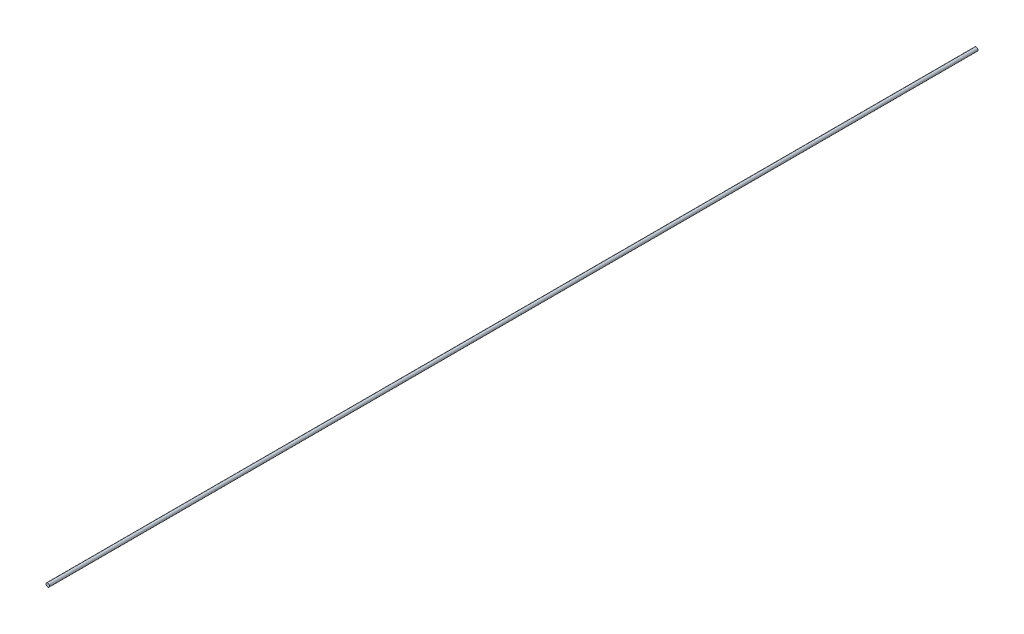
ISO-10303-21;
HEADER;
FILE_DESCRIPTION(('STEP AP214'),'2;1');
FILE_NAME('part.step','',(''),(''),'','','');
FILE_SCHEMA(('AUTOMOTIVE_DESIGN { 1 0 10303 214 1 1 1 1 }'));
ENDSEC;
DATA;
#1=APPLICATION_CONTEXT('core data for automotive mechanical design processes');
#2=APPLICATION_PROTOCOL_DEFINITION('international standard','automotive_design',2000,#1);
#3=PRODUCT_CONTEXT('',#1,'mechanical');
#4=PRODUCT('Part','Part','',(#3));
#5=PRODUCT_RELATED_PRODUCT_CATEGORY('part','',(#4));
#6=PRODUCT_DEFINITION_FORMATION('','',#4);
#7=PRODUCT_DEFINITION_CONTEXT('part definition',#1,'design');
#8=PRODUCT_DEFINITION('design','',#6,#7);
#9=PRODUCT_DEFINITION_SHAPE('','',#8);
#10=(LENGTH_UNIT() NAMED_UNIT(*) SI_UNIT(.MILLI.,.METRE.));
#11=(NAMED_UNIT(*) PLANE_ANGLE_UNIT() SI_UNIT($,.RADIAN.));
#12=(NAMED_UNIT(*) SI_UNIT($,.STERADIAN.) SOLID_ANGLE_UNIT());
#13=UNCERTAINTY_MEASURE_WITH_UNIT(LENGTH_MEASURE(1.E-05),#10,'distance_accuracy_value','');
#14=(GEOMETRIC_REPRESENTATION_CONTEXT(3) GLOBAL_UNCERTAINTY_ASSIGNED_CONTEXT((#13)) GLOBAL_UNIT_ASSIGNED_CONTEXT((#10,
#11,#12)) REPRESENTATION_CONTEXT('',''));
#15=CARTESIAN_POINT('',(0.,0.,0.));
#16=DIRECTION('',(0.,0.,1.));
#17=DIRECTION('',(1.,0.,0.));
#18=AXIS2_PLACEMENT_3D('',#15,#16,#17);
#19=CARTESIAN_POINT('',(0.,0.,1034.05));
#20=DIRECTION('',(0.,0.,-1.));
#21=DIRECTION('',(-1.,0.,0.));
#22=AXIS2_PLACEMENT_3D('',#19,#20,#21);
#23=CYLINDRICAL_SURFACE('',#22,2.);
#24=CARTESIAN_POINT('',(0.,0.,1034.05));
#25=DIRECTION('',(0.,0.,1.));
#26=DIRECTION('',(1.,0.,0.));
#27=AXIS2_PLACEMENT_3D('',#24,#25,#26);
#28=CIRCLE('',#27,2.);
#29=CARTESIAN_POINT('',(2.,0.,1034.05));
#30=VERTEX_POINT('',#29);
#31=EDGE_CURVE('E10',#30,#30,#28,.T.);
#32=ORIENTED_EDGE('',*,*,#31,.F.);
#33=EDGE_LOOP('',(#32));
#34=FACE_BOUND('',#33,.T.);
#35=CARTESIAN_POINT('',(0.,0.,0.));
#36=DIRECTION('',(0.,0.,1.));
#37=DIRECTION('',(1.,0.,0.));
#38=AXIS2_PLACEMENT_3D('',#35,#36,#37);
#39=CIRCLE('',#38,2.);
#40=CARTESIAN_POINT('',(2.,0.,0.));
#41=VERTEX_POINT('',#40);
#42=EDGE_CURVE('E42',#41,#41,#39,.T.);
#43=ORIENTED_EDGE('',*,*,#42,.T.);
#44=EDGE_LOOP('',(#43));
#45=FACE_BOUND('',#44,.T.);
#46=ADVANCED_FACE('F39',(#34,#45),#23,.T.);
#47=CARTESIAN_POINT('',(0.,0.,1034.05));
#48=DIRECTION('',(0.,0.,1.));
#49=DIRECTION('',(1.,0.,0.));
#50=AXIS2_PLACEMENT_3D('',#47,#48,#49);
#51=PLANE('',#50);
#52=ORIENTED_EDGE('',*,*,#31,.T.);
#53=EDGE_LOOP('',(#52));
#54=FACE_BOUND('',#53,.T.);
#55=ADVANCED_FACE('F54',(#54),#51,.T.);
#56=CARTESIAN_POINT('',(0.,0.,0.));
#57=DIRECTION('',(0.,0.,1.));
#58=DIRECTION('',(1.,0.,0.));
#59=AXIS2_PLACEMENT_3D('',#56,#57,#58);
#60=PLANE('',#59);
#61=ORIENTED_EDGE('',*,*,#42,.F.);
#62=EDGE_LOOP('',(#61));
#63=FACE_BOUND('',#62,.T.);
#64=ADVANCED_FACE('F52',(#63),#60,.F.);
#65=CLOSED_SHELL('',(#46,#55,#64));
#66=MANIFOLD_SOLID_BREP('B2',#65);
#67=ADVANCED_BREP_SHAPE_REPRESENTATION('',(#18,#66),#14);
#68=SHAPE_DEFINITION_REPRESENTATION(#9,#67);
ENDSEC;
END-ISO-10303-21;
